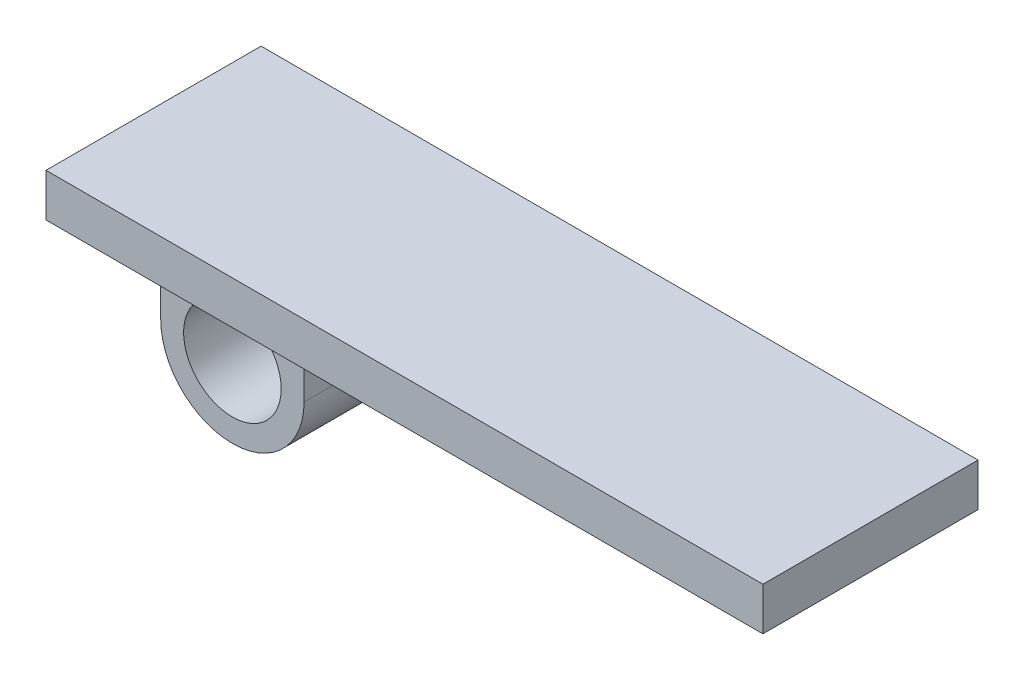
ISO-10303-21;
HEADER;
FILE_DESCRIPTION(('STEP AP214'),'2;1');
FILE_NAME('part.step','',(''),(''),'','','');
FILE_SCHEMA(('AUTOMOTIVE_DESIGN { 1 0 10303 214 1 1 1 1 }'));
ENDSEC;
DATA;
#1=APPLICATION_CONTEXT('core data for automotive mechanical design processes');
#2=APPLICATION_PROTOCOL_DEFINITION('international standard','automotive_design',2000,#1);
#3=PRODUCT_CONTEXT('',#1,'mechanical');
#4=PRODUCT('Part','Part','',(#3));
#5=PRODUCT_RELATED_PRODUCT_CATEGORY('part','',(#4));
#6=PRODUCT_DEFINITION_FORMATION('','',#4);
#7=PRODUCT_DEFINITION_CONTEXT('part definition',#1,'design');
#8=PRODUCT_DEFINITION('design','',#6,#7);
#9=PRODUCT_DEFINITION_SHAPE('','',#8);
#10=(LENGTH_UNIT() NAMED_UNIT(*) SI_UNIT(.MILLI.,.METRE.));
#11=(NAMED_UNIT(*) PLANE_ANGLE_UNIT() SI_UNIT($,.RADIAN.));
#12=(NAMED_UNIT(*) SI_UNIT($,.STERADIAN.) SOLID_ANGLE_UNIT());
#13=UNCERTAINTY_MEASURE_WITH_UNIT(LENGTH_MEASURE(1.E-05),#10,'distance_accuracy_value','');
#14=(GEOMETRIC_REPRESENTATION_CONTEXT(3) GLOBAL_UNCERTAINTY_ASSIGNED_CONTEXT((#13)) GLOBAL_UNIT_ASSIGNED_CONTEXT((#10,
#11,#12)) REPRESENTATION_CONTEXT('',''));
#15=CARTESIAN_POINT('',(0.,0.,0.));
#16=DIRECTION('',(0.,0.,1.));
#17=DIRECTION('',(1.,0.,0.));
#18=AXIS2_PLACEMENT_3D('',#15,#16,#17);
#19=CARTESIAN_POINT('',(5.,0.,7.));
#20=DIRECTION('',(-1.,0.,0.));
#21=DIRECTION('',(0.,0.,1.));
#22=AXIS2_PLACEMENT_3D('',#19,#20,#21);
#23=PLANE('',#22);
#24=DIRECTION('',(0.,1.,0.));
#25=VECTOR('',#24,1.);
#26=CARTESIAN_POINT('',(5.,0.,0.));
#27=LINE('',#26,#25);
#28=CARTESIAN_POINT('',(5.,0.,0.));
#29=VERTEX_POINT('',#28);
#30=CARTESIAN_POINT('',(5.,10.,0.));
#31=VERTEX_POINT('',#30);
#32=EDGE_CURVE('E82',#29,#31,#27,.T.);
#33=ORIENTED_EDGE('',*,*,#32,.T.);
#34=DIRECTION('',(0.,0.,-1.));
#35=VECTOR('',#34,1.);
#36=CARTESIAN_POINT('',(5.,10.,7.));
#37=LINE('',#36,#35);
#38=CARTESIAN_POINT('',(5.,10.,7.));
#39=VERTEX_POINT('',#38);
#40=EDGE_CURVE('E11',#39,#31,#37,.T.);
#41=ORIENTED_EDGE('',*,*,#40,.F.);
#42=DIRECTION('',(0.,1.,0.));
#43=VECTOR('',#42,1.);
#44=CARTESIAN_POINT('',(5.,0.,7.));
#45=LINE('',#44,#43);
#46=CARTESIAN_POINT('',(5.,0.,7.));
#47=VERTEX_POINT('',#46);
#48=EDGE_CURVE('E98',#47,#39,#45,.T.);
#49=ORIENTED_EDGE('',*,*,#48,.F.);
#50=DIRECTION('',(0.,0.,-1.));
#51=VECTOR('',#50,1.);
#52=CARTESIAN_POINT('',(5.,0.,7.));
#53=LINE('',#52,#51);
#54=EDGE_CURVE('E151',#47,#29,#53,.T.);
#55=ORIENTED_EDGE('',*,*,#54,.T.);
#56=EDGE_LOOP('',(#33,#41,#49,#55));
#57=FACE_BOUND('',#56,.T.);
#58=ADVANCED_FACE('F45',(#57),#23,.F.);
#59=CARTESIAN_POINT('',(-5.,0.,7.));
#60=DIRECTION('',(-1.,0.,0.));
#61=DIRECTION('',(0.,0.,1.));
#62=AXIS2_PLACEMENT_3D('',#59,#60,#61);
#63=PLANE('',#62);
#64=DIRECTION('',(0.,1.,0.));
#65=VECTOR('',#64,1.);
#66=CARTESIAN_POINT('',(-5.,0.,0.));
#67=LINE('',#66,#65);
#68=CARTESIAN_POINT('',(-5.,0.,0.));
#69=VERTEX_POINT('',#68);
#70=CARTESIAN_POINT('',(-5.,13.,0.));
#71=VERTEX_POINT('',#70);
#72=EDGE_CURVE('E154',#69,#71,#67,.T.);
#73=ORIENTED_EDGE('',*,*,#72,.F.);
#74=DIRECTION('',(0.,0.,-1.));
#75=VECTOR('',#74,1.);
#76=CARTESIAN_POINT('',(-5.,0.,7.));
#77=LINE('',#76,#75);
#78=CARTESIAN_POINT('',(-5.,0.,7.));
#79=VERTEX_POINT('',#78);
#80=EDGE_CURVE('E54',#79,#69,#77,.T.);
#81=ORIENTED_EDGE('',*,*,#80,.F.);
#82=DIRECTION('',(0.,1.,0.));
#83=VECTOR('',#82,1.);
#84=CARTESIAN_POINT('',(-5.,0.,7.));
#85=LINE('',#84,#83);
#86=CARTESIAN_POINT('',(-5.,10.,7.));
#87=VERTEX_POINT('',#86);
#88=EDGE_CURVE('E96',#79,#87,#85,.T.);
#89=ORIENTED_EDGE('',*,*,#88,.T.);
#90=DIRECTION('',(0.,0.,1.));
#91=VECTOR('',#90,1.);
#92=CARTESIAN_POINT('',(-5.,10.,0.));
#93=LINE('',#92,#91);
#94=CARTESIAN_POINT('',(-5.,10.,15.));
#95=VERTEX_POINT('',#94);
#96=EDGE_CURVE('E109',#87,#95,#93,.T.);
#97=ORIENTED_EDGE('',*,*,#96,.T.);
#98=DIRECTION('',(0.,-1.,0.));
#99=VECTOR('',#98,1.);
#100=CARTESIAN_POINT('',(-5.,13.,15.));
#101=LINE('',#100,#99);
#102=CARTESIAN_POINT('',(-5.,13.,15.));
#103=VERTEX_POINT('',#102);
#104=EDGE_CURVE('E134',#103,#95,#101,.T.);
#105=ORIENTED_EDGE('',*,*,#104,.F.);
#106=DIRECTION('',(0.,0.,1.));
#107=VECTOR('',#106,1.);
#108=CARTESIAN_POINT('',(-5.,13.,0.));
#109=LINE('',#108,#107);
#110=EDGE_CURVE('E169',#71,#103,#109,.T.);
#111=ORIENTED_EDGE('',*,*,#110,.F.);
#112=EDGE_LOOP('',(#73,#81,#89,#97,#105,#111));
#113=FACE_BOUND('',#112,.T.);
#114=ADVANCED_FACE('F106',(#113),#63,.T.);
#115=CARTESIAN_POINT('',(0.,0.,7.));
#116=DIRECTION('',(0.,0.,-1.));
#117=DIRECTION('',(-1.,0.,0.));
#118=AXIS2_PLACEMENT_3D('',#115,#116,#117);
#119=CYLINDRICAL_SURFACE('',#118,5.);
#120=CARTESIAN_POINT('',(0.,0.,0.));
#121=DIRECTION('',(0.,0.,1.));
#122=DIRECTION('',(1.,0.,0.));
#123=AXIS2_PLACEMENT_3D('',#120,#121,#122);
#124=CIRCLE('',#123,5.);
#125=EDGE_CURVE('E158',#69,#29,#124,.T.);
#126=ORIENTED_EDGE('',*,*,#125,.T.);
#127=ORIENTED_EDGE('',*,*,#54,.F.);
#128=CARTESIAN_POINT('',(0.,0.,7.));
#129=DIRECTION('',(0.,0.,1.));
#130=DIRECTION('',(1.,0.,0.));
#131=AXIS2_PLACEMENT_3D('',#128,#129,#130);
#132=CIRCLE('',#131,5.);
#133=EDGE_CURVE('E62',#79,#47,#132,.T.);
#134=ORIENTED_EDGE('',*,*,#133,.F.);
#135=ORIENTED_EDGE('',*,*,#80,.T.);
#136=EDGE_LOOP('',(#126,#127,#134,#135));
#137=FACE_BOUND('',#136,.T.);
#138=ADVANCED_FACE('F215',(#137),#119,.T.);
#139=CARTESIAN_POINT('',(0.,0.,7.));
#140=DIRECTION('',(0.,0.,-1.));
#141=DIRECTION('',(-1.,0.,0.));
#142=AXIS2_PLACEMENT_3D('',#139,#140,#141);
#143=CYLINDRICAL_SURFACE('',#142,3.4);
#144=CARTESIAN_POINT('',(0.,0.,7.));
#145=DIRECTION('',(0.,0.,1.));
#146=DIRECTION('',(1.,0.,0.));
#147=AXIS2_PLACEMENT_3D('',#144,#145,#146);
#148=CIRCLE('',#147,3.4);
#149=CARTESIAN_POINT('',(3.4,0.,7.));
#150=VERTEX_POINT('',#149);
#151=EDGE_CURVE('E147',#150,#150,#148,.T.);
#152=ORIENTED_EDGE('',*,*,#151,.T.);
#153=EDGE_LOOP('',(#152));
#154=FACE_BOUND('',#153,.T.);
#155=CARTESIAN_POINT('',(0.,0.,0.));
#156=DIRECTION('',(0.,0.,1.));
#157=DIRECTION('',(1.,0.,0.));
#158=AXIS2_PLACEMENT_3D('',#155,#156,#157);
#159=CIRCLE('',#158,3.4);
#160=CARTESIAN_POINT('',(3.4,0.,0.));
#161=VERTEX_POINT('',#160);
#162=EDGE_CURVE('E143',#161,#161,#159,.T.);
#163=ORIENTED_EDGE('',*,*,#162,.F.);
#164=EDGE_LOOP('',(#163));
#165=FACE_BOUND('',#164,.T.);
#166=ADVANCED_FACE('F219',(#154,#165),#143,.F.);
#167=CARTESIAN_POINT('',(0.,0.,7.));
#168=DIRECTION('',(0.,0.,1.));
#169=DIRECTION('',(1.,0.,0.));
#170=AXIS2_PLACEMENT_3D('',#167,#168,#169);
#171=PLANE('',#170);
#172=ORIENTED_EDGE('',*,*,#48,.T.);
#173=DIRECTION('',(1.,0.,0.));
#174=VECTOR('',#173,1.);
#175=CARTESIAN_POINT('',(0.,10.,7.));
#176=LINE('',#175,#174);
#177=EDGE_CURVE('E92',#87,#39,#176,.T.);
#178=ORIENTED_EDGE('',*,*,#177,.F.);
#179=ORIENTED_EDGE('',*,*,#88,.F.);
#180=ORIENTED_EDGE('',*,*,#133,.T.);
#181=EDGE_LOOP('',(#172,#178,#179,#180));
#182=FACE_BOUND('',#181,.T.);
#183=ORIENTED_EDGE('',*,*,#151,.F.);
#184=EDGE_LOOP('',(#183));
#185=FACE_BOUND('',#184,.T.);
#186=ADVANCED_FACE('F94',(#182,#185),#171,.T.);
#187=CARTESIAN_POINT('',(0.,0.,0.));
#188=DIRECTION('',(0.,0.,1.));
#189=DIRECTION('',(1.,0.,0.));
#190=AXIS2_PLACEMENT_3D('',#187,#188,#189);
#191=PLANE('',#190);
#192=ORIENTED_EDGE('',*,*,#32,.F.);
#193=ORIENTED_EDGE('',*,*,#125,.F.);
#194=ORIENTED_EDGE('',*,*,#72,.T.);
#195=DIRECTION('',(-1.,0.,0.));
#196=VECTOR('',#195,1.);
#197=CARTESIAN_POINT('',(45.,13.,0.));
#198=LINE('',#197,#196);
#199=CARTESIAN_POINT('',(45.,13.,0.));
#200=VERTEX_POINT('',#199);
#201=EDGE_CURVE('E173',#200,#71,#198,.T.);
#202=ORIENTED_EDGE('',*,*,#201,.F.);
#203=DIRECTION('',(0.,-1.,0.));
#204=VECTOR('',#203,1.);
#205=CARTESIAN_POINT('',(45.,13.,0.));
#206=LINE('',#205,#204);
#207=CARTESIAN_POINT('',(45.,10.,0.));
#208=VERTEX_POINT('',#207);
#209=EDGE_CURVE('E138',#200,#208,#206,.T.);
#210=ORIENTED_EDGE('',*,*,#209,.T.);
#211=DIRECTION('',(-1.,0.,0.));
#212=VECTOR('',#211,1.);
#213=CARTESIAN_POINT('',(45.,10.,0.));
#214=LINE('',#213,#212);
#215=EDGE_CURVE('E119',#208,#31,#214,.T.);
#216=ORIENTED_EDGE('',*,*,#215,.T.);
#217=EDGE_LOOP('',(#192,#193,#194,#202,#210,#216));
#218=FACE_BOUND('',#217,.T.);
#219=ORIENTED_EDGE('',*,*,#162,.T.);
#220=EDGE_LOOP('',(#219));
#221=FACE_BOUND('',#220,.T.);
#222=ADVANCED_FACE('F201',(#218,#221),#191,.F.);
#223=CARTESIAN_POINT('',(0.,10.,0.));
#224=DIRECTION('',(0.,1.,0.));
#225=DIRECTION('',(0.,0.,1.));
#226=AXIS2_PLACEMENT_3D('',#223,#224,#225);
#227=PLANE('',#226);
#228=ORIENTED_EDGE('',*,*,#96,.F.);
#229=ORIENTED_EDGE('',*,*,#177,.T.);
#230=ORIENTED_EDGE('',*,*,#40,.T.);
#231=ORIENTED_EDGE('',*,*,#215,.F.);
#232=DIRECTION('',(0.,0.,-1.));
#233=VECTOR('',#232,1.);
#234=CARTESIAN_POINT('',(45.,10.,15.));
#235=LINE('',#234,#233);
#236=CARTESIAN_POINT('',(45.,10.,15.));
#237=VERTEX_POINT('',#236);
#238=EDGE_CURVE('E126',#237,#208,#235,.T.);
#239=ORIENTED_EDGE('',*,*,#238,.F.);
#240=DIRECTION('',(-1.,0.,0.));
#241=VECTOR('',#240,1.);
#242=CARTESIAN_POINT('',(45.,10.,15.));
#243=LINE('',#242,#241);
#244=EDGE_CURVE('E117',#237,#95,#243,.T.);
#245=ORIENTED_EDGE('',*,*,#244,.T.);
#246=EDGE_LOOP('',(#228,#229,#230,#231,#239,#245));
#247=FACE_BOUND('',#246,.T.);
#248=ADVANCED_FACE('F114',(#247),#227,.F.);
#249=CARTESIAN_POINT('',(45.,13.,15.));
#250=DIRECTION('',(-1.,0.,0.));
#251=DIRECTION('',(0.,0.,1.));
#252=AXIS2_PLACEMENT_3D('',#249,#250,#251);
#253=PLANE('',#252);
#254=ORIENTED_EDGE('',*,*,#238,.T.);
#255=ORIENTED_EDGE('',*,*,#209,.F.);
#256=DIRECTION('',(0.,0.,-1.));
#257=VECTOR('',#256,1.);
#258=CARTESIAN_POINT('',(45.,13.,15.));
#259=LINE('',#258,#257);
#260=CARTESIAN_POINT('',(45.,13.,15.));
#261=VERTEX_POINT('',#260);
#262=EDGE_CURVE('E123',#261,#200,#259,.T.);
#263=ORIENTED_EDGE('',*,*,#262,.F.);
#264=DIRECTION('',(0.,-1.,0.));
#265=VECTOR('',#264,1.);
#266=CARTESIAN_POINT('',(45.,13.,15.));
#267=LINE('',#266,#265);
#268=EDGE_CURVE('E130',#261,#237,#267,.T.);
#269=ORIENTED_EDGE('',*,*,#268,.T.);
#270=EDGE_LOOP('',(#254,#255,#263,#269));
#271=FACE_BOUND('',#270,.T.);
#272=ADVANCED_FACE('F189',(#271),#253,.F.);
#273=CARTESIAN_POINT('',(45.,13.,15.));
#274=DIRECTION('',(0.,0.,1.));
#275=DIRECTION('',(1.,0.,0.));
#276=AXIS2_PLACEMENT_3D('',#273,#274,#275);
#277=PLANE('',#276);
#278=ORIENTED_EDGE('',*,*,#244,.F.);
#279=ORIENTED_EDGE('',*,*,#268,.F.);
#280=DIRECTION('',(-1.,0.,0.));
#281=VECTOR('',#280,1.);
#282=CARTESIAN_POINT('',(45.,13.,15.));
#283=LINE('',#282,#281);
#284=EDGE_CURVE('E135',#261,#103,#283,.T.);
#285=ORIENTED_EDGE('',*,*,#284,.T.);
#286=ORIENTED_EDGE('',*,*,#104,.T.);
#287=EDGE_LOOP('',(#278,#279,#285,#286));
#288=FACE_BOUND('',#287,.T.);
#289=ADVANCED_FACE('F193',(#288),#277,.T.);
#290=CARTESIAN_POINT('',(0.,13.,0.));
#291=DIRECTION('',(0.,1.,0.));
#292=DIRECTION('',(0.,0.,1.));
#293=AXIS2_PLACEMENT_3D('',#290,#291,#292);
#294=PLANE('',#293);
#295=ORIENTED_EDGE('',*,*,#262,.T.);
#296=ORIENTED_EDGE('',*,*,#201,.T.);
#297=ORIENTED_EDGE('',*,*,#110,.T.);
#298=ORIENTED_EDGE('',*,*,#284,.F.);
#299=EDGE_LOOP('',(#295,#296,#297,#298));
#300=FACE_BOUND('',#299,.T.);
#301=ADVANCED_FACE('F203',(#300),#294,.T.);
#302=CLOSED_SHELL('',(#58,#114,#138,#166,#186,#222,#248,#272,#289,#301));
#303=MANIFOLD_SOLID_BREP('B2',#302);
#304=ADVANCED_BREP_SHAPE_REPRESENTATION('',(#18,#303),#14);
#305=SHAPE_DEFINITION_REPRESENTATION(#9,#304);
ENDSEC;
END-ISO-10303-21;
